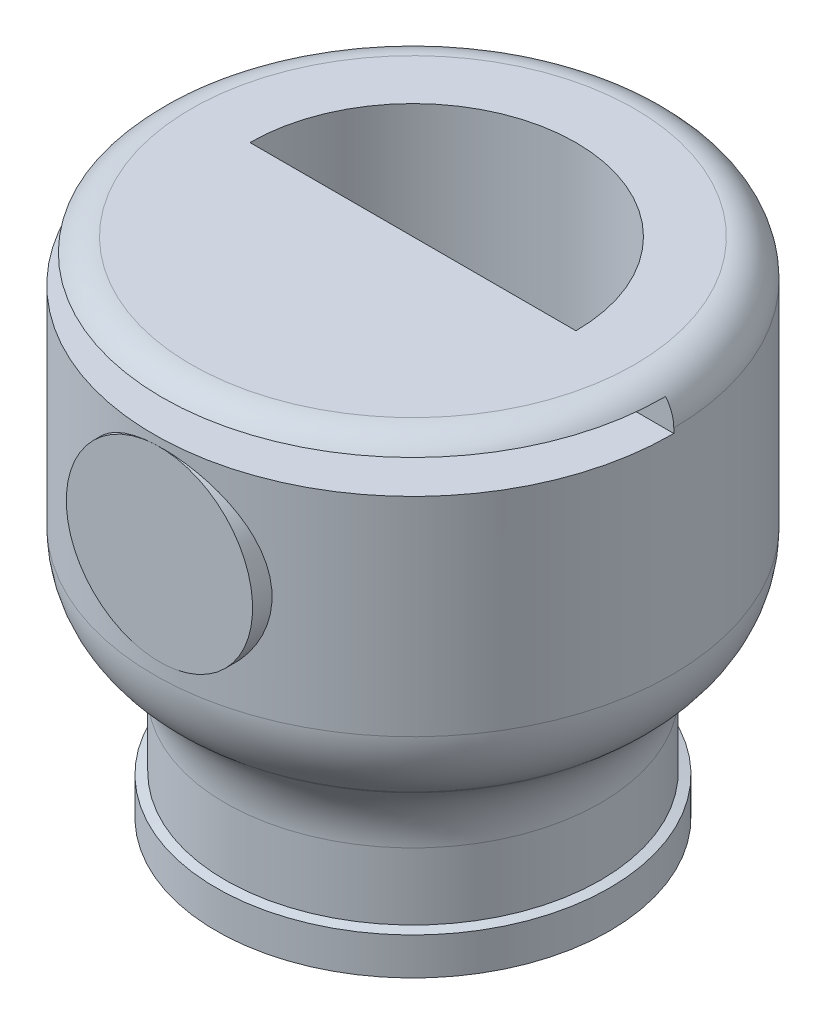
ISO-10303-21;
HEADER;
FILE_DESCRIPTION(('STEP AP214'),'2;1');
FILE_NAME('part.step','',(''),(''),'','','');
FILE_SCHEMA(('AUTOMOTIVE_DESIGN { 1 0 10303 214 1 1 1 1 }'));
ENDSEC;
DATA;
#1=APPLICATION_CONTEXT('core data for automotive mechanical design processes');
#2=APPLICATION_PROTOCOL_DEFINITION('international standard','automotive_design',2000,#1);
#3=PRODUCT_CONTEXT('',#1,'mechanical');
#4=PRODUCT('Part','Part','',(#3));
#5=PRODUCT_RELATED_PRODUCT_CATEGORY('part','',(#4));
#6=PRODUCT_DEFINITION_FORMATION('','',#4);
#7=PRODUCT_DEFINITION_CONTEXT('part definition',#1,'design');
#8=PRODUCT_DEFINITION('design','',#6,#7);
#9=PRODUCT_DEFINITION_SHAPE('','',#8);
#10=(LENGTH_UNIT() NAMED_UNIT(*) SI_UNIT(.MILLI.,.METRE.));
#11=(NAMED_UNIT(*) PLANE_ANGLE_UNIT() SI_UNIT($,.RADIAN.));
#12=(NAMED_UNIT(*) SI_UNIT($,.STERADIAN.) SOLID_ANGLE_UNIT());
#13=UNCERTAINTY_MEASURE_WITH_UNIT(LENGTH_MEASURE(1.E-05),#10,'distance_accuracy_value','');
#14=(GEOMETRIC_REPRESENTATION_CONTEXT(3) GLOBAL_UNCERTAINTY_ASSIGNED_CONTEXT((#13)) GLOBAL_UNIT_ASSIGNED_CONTEXT((#10,
#11,#12)) REPRESENTATION_CONTEXT('',''));
#15=CARTESIAN_POINT('',(0.,0.,0.));
#16=DIRECTION('',(0.,0.,1.));
#17=DIRECTION('',(1.,0.,0.));
#18=AXIS2_PLACEMENT_3D('',#15,#16,#17);
#19=CARTESIAN_POINT('',(2.76491495539483,7.82182165652493,0.));
#20=DIRECTION('',(0.,-1.,0.));
#21=DIRECTION('',(1.,0.,0.));
#22=AXIS2_PLACEMENT_3D('',#19,#20,#21);
#23=CYLINDRICAL_SURFACE('',#22,27.795529475795);
#24=CARTESIAN_POINT('',(2.76491495539483,49.5,0.));
#25=DIRECTION('',(0.,-1.,0.));
#26=DIRECTION('',(0.,0.,-1.));
#27=AXIS2_PLACEMENT_3D('',#24,#25,#26);
#28=CIRCLE('',#27,27.795529475795);
#29=CARTESIAN_POINT('',(-25.0298624433274,49.5,-0.204470524205008));
#30=VERTEX_POINT('',#29);
#31=CARTESIAN_POINT('',(30.559692354117,49.5,-0.204470524205008));
#32=VERTEX_POINT('',#31);
#33=EDGE_CURVE('E126',#30,#32,#28,.F.);
#34=ORIENTED_EDGE('',*,*,#33,.F.);
#35=DIRECTION('',(0.,-1.,0.));
#36=VECTOR('',#35,1.);
#37=CARTESIAN_POINT('',(-25.0298624433274,7.82182165652492,-0.204470524205008));
#38=LINE('',#37,#36);
#39=CARTESIAN_POINT('',(-25.0298624433274,50.,-0.204470524205008));
#40=VERTEX_POINT('',#39);
#41=EDGE_CURVE('E167',#30,#40,#38,.F.);
#42=ORIENTED_EDGE('',*,*,#41,.T.);
#43=CARTESIAN_POINT('',(2.76491495539482,50.,0.));
#44=DIRECTION('',(0.,-1.,0.));
#45=DIRECTION('',(1.,0.,0.));
#46=AXIS2_PLACEMENT_3D('',#43,#44,#45);
#47=CIRCLE('',#46,27.795529475795);
#48=CARTESIAN_POINT('',(30.5596923541171,50.,-0.204470524205008));
#49=VERTEX_POINT('',#48);
#50=EDGE_CURVE('E200',#40,#49,#47,.T.);
#51=ORIENTED_EDGE('',*,*,#50,.T.);
#52=DIRECTION('',(0.,-1.,0.));
#53=VECTOR('',#52,1.);
#54=CARTESIAN_POINT('',(30.5596923541171,7.82182165652493,-0.204470524205008));
#55=LINE('',#54,#53);
#56=EDGE_CURVE('E49',#49,#32,#55,.T.);
#57=ORIENTED_EDGE('',*,*,#56,.T.);
#58=EDGE_LOOP('',(#34,#42,#51,#57));
#59=FACE_BOUND('',#58,.T.);
#60=CARTESIAN_POINT('',(13.3463458867871,38.6583373621054,25.7026220118486));
#61=CARTESIAN_POINT('',(13.3463467506797,38.9277821022739,25.7026212426184));
#62=CARTESIAN_POINT('',(13.3354465811937,39.1972148635378,25.7071171137235));
#63=CARTESIAN_POINT('',(13.2919687629021,39.7340174371551,25.7249519118154));
#64=CARTESIAN_POINT('',(13.2593923457373,40.0013873658451,25.7382903363697));
#65=CARTESIAN_POINT('',(13.1729081194495,40.5320945802206,25.7733836810905));
#66=CARTESIAN_POINT('',(13.1189995294657,40.79543171792,25.7951389093522));
#67=CARTESIAN_POINT('',(12.9903943982892,41.3162067659098,25.8463887620421));
#68=CARTESIAN_POINT('',(12.9156973821031,41.5736445412607,25.8758835633105));
#69=CARTESIAN_POINT('',(12.7464464105734,42.0802133582729,25.9416402412638));
#70=CARTESIAN_POINT('',(12.651947157288,42.329365136829,25.9778834459237));
#71=CARTESIAN_POINT('',(12.44373220242,42.8186599126973,26.0561762717797));
#72=CARTESIAN_POINT('',(12.330009340582,43.0587995123479,26.0982280554375));
#73=CARTESIAN_POINT('',(12.0842401425005,43.528602925991,26.1869948362899));
#74=CARTESIAN_POINT('',(11.9521936997097,43.7582666790585,26.2337098605997));
#75=CARTESIAN_POINT('',(11.6706780123648,44.2058963523142,26.3306095370754));
#76=CARTESIAN_POINT('',(11.5212074978844,44.4238614181689,26.3807944420297));
#77=CARTESIAN_POINT('',(11.1985025620434,44.8567103541455,26.4857726252769));
#78=CARTESIAN_POINT('',(11.0244902858668,45.0709889713522,26.5406716961283));
#79=CARTESIAN_POINT('',(10.6595087786535,45.4842923905928,26.6515143306982));
#80=CARTESIAN_POINT('',(10.4685391398865,45.683316825634,26.7074579195059));
#81=CARTESIAN_POINT('',(10.0707167754452,46.0650127403382,26.8190118536809));
#82=CARTESIAN_POINT('',(9.86386023069171,46.2476802649348,26.8746221154337));
#83=CARTESIAN_POINT('',(9.43549130510837,46.5954921209992,26.9841386350754));
#84=CARTESIAN_POINT('',(9.21397928881647,46.7606368880596,27.038044935299));
#85=CARTESIAN_POINT('',(8.74863878036111,47.0784128766494,27.1449016086897));
#86=CARTESIAN_POINT('',(8.50427674096215,47.2303042566693,27.1977325815785));
#87=CARTESIAN_POINT('',(8.00273380579803,47.5127627227737,27.2987566692341));
#88=CARTESIAN_POINT('',(7.74555800532649,47.6433381980195,27.3469516054933));
#89=CARTESIAN_POINT('',(7.2200167476639,47.8821093354802,27.4374672990011));
#90=CARTESIAN_POINT('',(6.95165142646173,47.9903052695837,27.4797881276121));
#91=CARTESIAN_POINT('',(6.40564839316566,48.1832779921821,27.5574406379041));
#92=CARTESIAN_POINT('',(6.12801115886875,48.2680559853613,27.5927726790812));
#93=CARTESIAN_POINT('',(5.57638215157694,48.4105135832943,27.6543152072922));
#94=CARTESIAN_POINT('',(5.30266011964647,48.4691091447917,27.6808239838258));
#95=CARTESIAN_POINT('',(4.75062513289938,48.5632043331973,27.7258920994341));
#96=CARTESIAN_POINT('',(4.4723122799301,48.5987044717727,27.7444516146174));
#97=CARTESIAN_POINT('',(3.91333763495258,48.6461887564039,27.7732043831257));
#98=CARTESIAN_POINT('',(3.6326765478635,48.6581797221137,27.7834000621734));
#99=CARTESIAN_POINT('',(3.07116470286908,48.6584918943381,27.7952607055486));
#100=CARTESIAN_POINT('',(2.79031395171638,48.6468139032719,27.7969259590657));
#101=CARTESIAN_POINT('',(2.24491810603403,48.6010682628443,27.7919345123894));
#102=CARTESIAN_POINT('',(1.9802701976664,48.5681695673053,27.7856967619089));
#103=CARTESIAN_POINT('',(1.45472369944559,48.4814067313321,27.7658783501912));
#104=CARTESIAN_POINT('',(1.19382496243998,48.4275434160882,27.7522979779594));
#105=CARTESIAN_POINT('',(0.677577935562517,48.2993135221171,27.7182504886453));
#106=CARTESIAN_POINT('',(0.422229730170447,48.2249466315582,27.6977832668222));
#107=CARTESIAN_POINT('',(-0.0812182002820311,48.0563308589155,27.6505861686878));
#108=CARTESIAN_POINT('',(-0.329317769825685,47.9620815506179,27.6238561581216));
#109=CARTESIAN_POINT('',(-0.818471743992125,47.753692525213,27.5646864705793));
#110=CARTESIAN_POINT('',(-1.05946155178538,47.6394127245774,27.5322065644623));
#111=CARTESIAN_POINT('',(-1.53110602263131,47.3922583555493,27.4625657330638));
#112=CARTESIAN_POINT('',(-1.76175692596454,47.2593770940488,27.4254031233522));
#113=CARTESIAN_POINT('',(-2.21130548967729,46.9759762894753,27.3474083145757));
#114=CARTESIAN_POINT('',(-2.43020277787631,46.8254561883447,27.3065759994182));
#115=CARTESIAN_POINT('',(-2.85503064445834,46.5077508697439,27.2223176301386));
#116=CARTESIAN_POINT('',(-3.06096039890063,46.340564595066,27.1788914115441));
#117=CARTESIAN_POINT('',(-3.46888943397179,45.9815950003482,27.0883184701548));
#118=CARTESIAN_POINT('',(-3.670150520127,45.7889914436546,27.0410950137027));
#119=CARTESIAN_POINT('',(-4.05588736727981,45.3877061868811,26.9463832037301));
#120=CARTESIAN_POINT('',(-4.24036262263078,45.1790240028073,26.8988948422756));
#121=CARTESIAN_POINT('',(-4.5914220414673,44.7467994372934,26.8050143466062));
#122=CARTESIAN_POINT('',(-4.75800206361397,44.5232536353894,26.7586224680701));
#123=CARTESIAN_POINT('',(-5.07212087537345,44.0626976394474,26.6683153425431));
#124=CARTESIAN_POINT('',(-5.2196603768811,43.8256879492801,26.6244000029929));
#125=CARTESIAN_POINT('',(-5.49772859126478,43.3342142456592,26.5394385045658));
#126=CARTESIAN_POINT('',(-5.62780461077978,43.0794788683478,26.4984781635685));
#127=CARTESIAN_POINT('',(-5.86586399421236,42.559232637673,26.4218991371288));
#128=CARTESIAN_POINT('',(-5.97385638830328,42.2937262421033,26.3862782699295));
#129=CARTESIAN_POINT('',(-6.1668392723074,41.7537372736574,26.3215803603233));
#130=CARTESIAN_POINT('',(-6.2518328039325,41.4792558931539,26.2925024526638));
#131=CARTESIAN_POINT('',(-6.39800337069516,40.9233418126132,26.2419203231456));
#132=CARTESIAN_POINT('',(-6.45918167304372,40.6419094832844,26.2204156983175));
#133=CARTESIAN_POINT('',(-6.55494105559617,40.0867471613471,26.1865271745711));
#134=CARTESIAN_POINT('',(-6.59056927192223,39.8132193541774,26.1737851983376));
#135=CARTESIAN_POINT('',(-6.63910912568212,39.2639004168782,26.1563847172211));
#136=CARTESIAN_POINT('',(-6.6520214135389,38.9881093517795,26.1517259808916));
#137=CARTESIAN_POINT('',(-6.65499588625463,38.436440217703,26.1506546773984));
#138=CARTESIAN_POINT('',(-6.64506227006915,38.1605621740297,26.1542405949113));
#139=CARTESIAN_POINT('',(-6.60245672026117,37.6107987661365,26.1695303281976));
#140=CARTESIAN_POINT('',(-6.56978514634915,37.3369133704626,26.1812340155494));
#141=CARTESIAN_POINT('',(-6.48373595936502,36.8037277442479,26.2117512471871));
#142=CARTESIAN_POINT('',(-6.43120768216105,36.5442730018554,26.2302724288113));
#143=CARTESIAN_POINT('',(-6.30589572281171,36.0307712719075,26.2738700992557));
#144=CARTESIAN_POINT('',(-6.23310488253185,35.7767262296359,26.2989489044905));
#145=CARTESIAN_POINT('',(-6.06790705793705,35.2758269101046,26.3548915465073));
#146=CARTESIAN_POINT('',(-5.97550466195667,35.0289709662142,26.3857540299383));
#147=CARTESIAN_POINT('',(-5.77175338960273,34.5437867607262,26.4523767744537));
#148=CARTESIAN_POINT('',(-5.66039717760229,34.3054618442483,26.4881389307914));
#149=CARTESIAN_POINT('',(-5.41581964512394,33.831564001845,26.564712662015));
#150=CARTESIAN_POINT('',(-5.28202751992324,33.5963054174963,26.605646401383));
#151=CARTESIAN_POINT('',(-4.99603821175475,33.1376763735824,26.6904723195448));
#152=CARTESIAN_POINT('',(-4.84383279563464,32.9143112967348,26.734365817827));
#153=CARTESIAN_POINT('',(-4.52202772496277,32.4808325603602,26.8238664339569));
#154=CARTESIAN_POINT('',(-4.35242713478869,32.270719614599,26.8694736438951));
#155=CARTESIAN_POINT('',(-3.99685318796656,31.864943181332,26.9611508600873));
#156=CARTESIAN_POINT('',(-3.81087945517322,31.6692800259756,27.007220876952));
#157=CARTESIAN_POINT('',(-3.41386155361355,31.2840646941256,27.1008825380269));
#158=CARTESIAN_POINT('',(-3.20202640665692,31.0953168380638,27.1484339302512));
#159=CARTESIAN_POINT('',(-2.76286436248656,30.7363456425542,27.2412455306916));
#160=CARTESIAN_POINT('',(-2.53554312242131,30.5661155968439,27.2865065651682));
#161=CARTESIAN_POINT('',(-2.06667271203996,30.2452550666619,27.3734191976298));
#162=CARTESIAN_POINT('',(-1.82511812373015,30.0946321166597,27.4150694060318));
#163=CARTESIAN_POINT('',(-1.32953585786986,29.8142919890175,27.4934506514793));
#164=CARTESIAN_POINT('',(-1.07551358642064,29.6845658530069,27.5301837953007));
#165=CARTESIAN_POINT('',(-0.558963445896263,29.4480975901194,27.5972916324096));
#166=CARTESIAN_POINT('',(-0.296532196118554,29.3411599161002,27.6277203553277));
#167=CARTESIAN_POINT('',(0.237105421191776,29.1497639570286,27.681646347434));
#168=CARTESIAN_POINT('',(0.508311784862325,29.0653056620829,27.7051436196728));
#169=CARTESIAN_POINT('',(1.05736622775294,28.9196922101092,27.7443950186722));
#170=CARTESIAN_POINT('',(1.33521203382265,28.8585291955788,27.760151756837));
#171=CARTESIAN_POINT('',(1.89543988383297,28.7600674488549,27.7833412546476));
#172=CARTESIAN_POINT('',(2.17782171303057,28.7227675903324,27.7907744071749));
#173=CARTESIAN_POINT('',(2.73014021528458,28.6736923897316,27.7968081006747));
#174=CARTESIAN_POINT('',(2.99996433279007,28.6606955856305,27.7958459939314));
#175=CARTESIAN_POINT('',(3.53963003763627,28.6565651175248,27.7860414433971));
#176=CARTESIAN_POINT('',(3.8094716239489,28.6654306374236,27.7771992937672));
#177=CARTESIAN_POINT('',(4.34716757247668,28.7048945975942,27.7517634945061));
#178=CARTESIAN_POINT('',(4.61502208219522,28.7354914080766,27.7351704262052));
#179=CARTESIAN_POINT('',(5.14683840460148,28.8180812466258,27.6945666520365));
#180=CARTESIAN_POINT('',(5.41080019683061,28.870074387102,27.6705559071988));
#181=CARTESIAN_POINT('',(5.92904610024611,28.9939919992937,27.6160569422403));
#182=CARTESIAN_POINT('',(6.18341619783529,29.0656031552389,27.5856721734139));
#183=CARTESIAN_POINT('',(6.68506895537541,29.2284645935136,27.5188646144497));
#184=CARTESIAN_POINT('',(6.93234905101865,29.3197218823934,27.4824396712259));
#185=CARTESIAN_POINT('',(7.41818360014348,29.5210909377065,27.4043623721521));
#186=CARTESIAN_POINT('',(7.65673988387677,29.6311987214527,27.3627111209994));
#187=CARTESIAN_POINT('',(8.12391548923101,29.869502337868,27.2750634742108));
#188=CARTESIAN_POINT('',(8.35253092803971,29.9977051567529,27.2290654026116));
#189=CARTESIAN_POINT('',(8.80852283960875,30.2774457183902,27.1315873881407));
#190=CARTESIAN_POINT('',(9.03538233947552,30.4297729865935,27.079954013771));
#191=CARTESIAN_POINT('',(9.47561863541725,30.7522319968814,26.9742320700564));
#192=CARTESIAN_POINT('',(9.68898924827505,30.9223718105583,26.9201423940019));
#193=CARTESIAN_POINT('',(10.1009819192527,31.2793675026282,26.8108003364131));
#194=CARTESIAN_POINT('',(10.2996021560979,31.4662254390003,26.7555478123759));
#195=CARTESIAN_POINT('',(10.6809508336662,31.8555565786895,26.6452105314894));
#196=CARTESIAN_POINT('',(10.8636790200245,32.0580300318472,26.5901257773391));
#197=CARTESIAN_POINT('',(11.2206302863772,32.4876508411687,26.4788399761401));
#198=CARTESIAN_POINT('',(11.394011161067,32.7155185914245,26.4227143435104));
#199=CARTESIAN_POINT('',(11.7208572308537,33.1857229334844,26.3137271080731));
#200=CARTESIAN_POINT('',(11.8743299975217,33.4280539730205,26.2608642683739));
#201=CARTESIAN_POINT('',(12.1603208389707,33.9258673231902,26.1599086931028));
#202=CARTESIAN_POINT('',(12.2928309519575,34.1813545820673,26.1118177725189));
#203=CARTESIAN_POINT('',(12.5356343745004,34.7036110828207,26.0219381487292));
#204=CARTESIAN_POINT('',(12.6459377702971,34.9703751358822,25.9801465865465));
#205=CARTESIAN_POINT('',(12.8433877754872,35.5135432745424,25.9041898684053));
#206=CARTESIAN_POINT('',(12.9305241387967,35.789951564566,25.8700280879356));
#207=CARTESIAN_POINT('',(13.0806448742074,36.3501956411642,25.8105348341637));
#208=CARTESIAN_POINT('',(13.143629103182,36.6340314717442,25.7852034131907));
#209=CARTESIAN_POINT('',(13.2446847730938,37.2066584983713,25.7442976712579));
#210=CARTESIAN_POINT('',(13.2827686278462,37.4954471514337,25.7287184885891));
#211=CARTESIAN_POINT('',(13.3335977957686,38.0756077855596,25.7078814502822));
#212=CARTESIAN_POINT('',(13.346344952637,38.3669795771037,25.7026228436376));
#213=CARTESIAN_POINT('',(13.3463458867871,38.6583373621054,25.7026220118486));
#214=B_SPLINE_CURVE_WITH_KNOTS('',3,(#60,#61,#62,#63,#64,#65,#66,#67,#68,#69,#70,#71,#72,#73,
#74,#75,#76,#77,#78,#79,#80,#81,#82,#83,#84,#85,#86,#87,#88,#89,#90,#91,#92,#93,#94,#95,#96,#97,
#98,#99,#100,#101,#102,#103,#104,#105,#106,#107,#108,#109,#110,#111,#112,#113,#114,#115,#116,
#117,#118,#119,#120,#121,#122,#123,#124,#125,#126,#127,#128,#129,#130,#131,#132,#133,#134,#135,
#136,#137,#138,#139,#140,#141,#142,#143,#144,#145,#146,#147,#148,#149,#150,#151,#152,#153,#154,
#155,#156,#157,#158,#159,#160,#161,#162,#163,#164,#165,#166,#167,#168,#169,#170,#171,#172,#173,
#174,#175,#176,#177,#178,#179,#180,#181,#182,#183,#184,#185,#186,#187,#188,#189,#190,#191,#192,
#193,#194,#195,#196,#197,#198,#199,#200,#201,#202,#203,#204,#205,#206,#207,#208,#209,#210,#211,
#212,#213),.UNSPECIFIED.,.T.,.F.,(4,2,2,2,2,2,2,2,2,2,2,2,2,2,2,2,2,2,2,2,2,2,2,2,2,2,2,2,2,2,2,
2,2,2,2,2,2,2,2,2,2,2,2,2,2,2,2,2,2,2,2,2,2,2,2,2,2,2,2,2,2,2,2,2,2,2,2,2,2,2,2,2,2,2,2,2,4),
(0.,0.808057267816626,1.61606862586876,2.42410956378593,3.23216896609579,4.03802492206399,
4.84418170086265,5.65034316747197,6.45656342668973,7.29995003129204,8.14335692014369,
8.98696719539949,9.83055649470299,10.7070666362457,11.5832309794046,12.4593846774343,
13.3354932952741,14.1779427925391,15.0203736251361,15.8625600451619,16.7047179140628,
17.5040433523017,18.3033373313968,19.1026434673403,19.9019667395222,20.7071210172973,
21.5125657509117,22.318035974067,23.1235573242502,23.9702286044995,24.8169253809448,
25.6638176808941,26.5106783077056,27.3764233110585,28.2418135932405,29.1070893673299,
29.972319093704,30.7996703059205,31.6269978282852,32.4541733044068,33.2813356950554,
34.0765196457537,34.8719848675378,35.6672641864203,36.4628520021808,37.2831030231985,
38.1037221688819,38.9243854758148,39.7450676410223,40.6070903069241,41.4687997429028,
42.3308393387977,43.1925083929845,44.0464558479673,44.900402927119,45.7540617141408,
46.6076802059269,47.4171058287024,48.2265012369672,49.0358359491252,49.8451749133136,
50.6422741257852,51.4396580861568,52.236873784605,53.0343981220641,53.8677478695687,
54.7014768899097,55.5353086827934,56.3691538193559,57.2434367976375,58.117386282314,
58.9916669076093,59.8655495362763,60.7398180165261,61.6140916776499,62.4879291459793,
63.3617030246541),.UNSPECIFIED.);
#215=CARTESIAN_POINT('',(2.76491495539483,48.6414199557745,27.795529475795));
#216=VERTEX_POINT('',#215);
#217=CARTESIAN_POINT('',(2.76491495539483,28.6752547684362,27.795529475795));
#218=VERTEX_POINT('',#217);
#219=EDGE_CURVE('E233',#216,#218,#214,.T.);
#220=ORIENTED_EDGE('',*,*,#219,.F.);
#221=EDGE_CURVE('E226',#218,#216,#214,.T.);
#222=ORIENTED_EDGE('',*,*,#221,.F.);
#223=EDGE_LOOP('',(#220,#222));
#224=FACE_BOUND('',#223,.T.);
#225=CARTESIAN_POINT('',(2.76491495539483,27.1583373621054,0.));
#226=DIRECTION('',(0.,-1.,0.));
#227=DIRECTION('',(1.,0.,0.));
#228=AXIS2_PLACEMENT_3D('',#225,#226,#227);
#229=CIRCLE('',#228,27.795529475795);
#230=CARTESIAN_POINT('',(30.5604444311898,27.1583373621054,0.));
#231=VERTEX_POINT('',#230);
#232=EDGE_CURVE('E202',#231,#231,#229,.T.);
#233=ORIENTED_EDGE('',*,*,#232,.F.);
#234=EDGE_LOOP('',(#233));
#235=FACE_BOUND('',#234,.T.);
#236=ADVANCED_FACE('F34',(#59,#224,#235),#23,.T.);
#237=CARTESIAN_POINT('',(2.76491495539482,50.,0.));
#238=DIRECTION('',(0.,-1.,0.));
#239=DIRECTION('',(1.,0.,0.));
#240=AXIS2_PLACEMENT_3D('',#237,#238,#239);
#241=TOROIDAL_SURFACE('',#240,23.795529475795,4.);
#242=CARTESIAN_POINT('',(2.76491495539482,54.,0.));
#243=DIRECTION('',(0.,-1.,0.));
#244=DIRECTION('',(1.,0.,0.));
#245=AXIS2_PLACEMENT_3D('',#242,#243,#244);
#246=CIRCLE('',#245,23.795529475795);
#247=CARTESIAN_POINT('',(26.5604444311898,54.,0.));
#248=VERTEX_POINT('',#247);
#249=EDGE_CURVE('E197',#248,#248,#246,.T.);
#250=ORIENTED_EDGE('',*,*,#249,.T.);
#251=EDGE_LOOP('',(#250));
#252=FACE_BOUND('',#251,.T.);
#253=ORIENTED_EDGE('',*,*,#50,.F.);
#254=CARTESIAN_POINT('',(-24.5314051280273,51.9336759427929,-0.204470524205008));
#255=CARTESIAN_POINT('',(-24.4227775221481,52.1303558264312,-0.204470524205008));
#256=CARTESIAN_POINT('',(-24.2974608397906,52.3180053261456,-0.204470524205008));
#257=CARTESIAN_POINT('',(-24.0169936166561,52.6697545252074,-0.204470524205008));
#258=CARTESIAN_POINT('',(-23.8618073184071,52.8338255829973,-0.204470524205008));
#259=CARTESIAN_POINT('',(-23.5261474209365,53.1335153156774,-0.204470524205008));
#260=CARTESIAN_POINT('',(-23.3456859574281,53.2691475676978,-0.204470524205008));
#261=CARTESIAN_POINT('',(-22.9646026225883,53.5081515594489,-0.204470524205008));
#262=CARTESIAN_POINT('',(-22.7639857715993,53.6115313064872,-0.204470524205008));
#263=CARTESIAN_POINT('',(-22.3482182414279,53.7831609837609,-0.204470524205008));
#264=CARTESIAN_POINT('',(-22.133065731007,53.8514064783247,-0.204470524205008));
#265=CARTESIAN_POINT('',(-21.6943489108472,53.9508112477646,-0.204470524205008));
#266=CARTESIAN_POINT('',(-21.4707842697265,53.9819690600526,-0.204470524205008));
#267=CARTESIAN_POINT('',(-21.0215948407496,54.0063101772925,-0.204470524205008));
#268=CARTESIAN_POINT('',(-20.7959700319209,53.9994930952306,-0.204470524205008));
#269=CARTESIAN_POINT('',(-20.3490676435651,53.9480771472642,-0.204470524205008));
#270=CARTESIAN_POINT('',(-20.1277900558634,53.9034783524129,-0.204470524205008));
#271=CARTESIAN_POINT('',(-19.6958590097248,53.7777639273787,-0.204470524205008));
#272=CARTESIAN_POINT('',(-19.4852057391639,53.6966476516874,-0.204470524205008));
#273=CARTESIAN_POINT('',(-19.0805079003628,53.5002006151039,-0.204470524205008));
#274=CARTESIAN_POINT('',(-18.8864633022403,53.3848699157717,-0.204470524205008));
#275=CARTESIAN_POINT('',(-18.5204927542783,53.1232685682537,-0.204470524205008));
#276=CARTESIAN_POINT('',(-18.3485666173277,52.9769981818297,-0.204470524205008));
#277=CARTESIAN_POINT('',(-18.0317121789,52.6576684757407,-0.204470524205008));
#278=CARTESIAN_POINT('',(-17.8867839013364,52.4846091323476,-0.204470524205008));
#279=CARTESIAN_POINT('',(-17.6280453044935,52.1166208236156,-0.204470524205008));
#280=CARTESIAN_POINT('',(-17.5142338598575,51.9216926495345,-0.204470524205008));
#281=CARTESIAN_POINT('',(-17.3209538767335,51.5154950950823,-0.204470524205008));
#282=CARTESIAN_POINT('',(-17.2414853145748,51.3042257259744,-0.204470524205008));
#283=CARTESIAN_POINT('',(-17.119150809479,50.8713538935252,-0.204470524205008));
#284=CARTESIAN_POINT('',(-17.0762831113116,50.6497519262312,-0.204470524205008));
#285=CARTESIAN_POINT('',(-17.0283612795209,50.202496390005,-0.204470524205008));
#286=CARTESIAN_POINT('',(-17.0233071423582,49.976842821452,-0.204470524205008));
#287=CARTESIAN_POINT('',(-17.051155515113,49.5278974080903,-0.204470524205008));
#288=CARTESIAN_POINT('',(-17.084056810985,49.3046054879723,-0.204470524205008));
#289=CARTESIAN_POINT('',(-17.1868797282554,48.8667145764249,-0.204470524205008));
#290=CARTESIAN_POINT('',(-17.2568013476127,48.6521155845161,-0.204470524205008));
#291=CARTESIAN_POINT('',(-17.4316799658814,48.2377007160222,-0.204470524205008));
#292=CARTESIAN_POINT('',(-17.5366371775572,48.0378849292215,-0.204470524205008));
#293=CARTESIAN_POINT('',(-17.7786068257058,47.658709302277,-0.204470524205008));
#294=CARTESIAN_POINT('',(-17.9156192699505,47.4793494670928,-0.204470524205008));
#295=CARTESIAN_POINT('',(-18.217815691837,47.1461694961469,-0.204470524205008));
#296=CARTESIAN_POINT('',(-18.3830007904772,46.9923503771388,-0.204470524205008));
#297=CARTESIAN_POINT('',(-18.7368493806334,46.714626016031,-0.204470524205008));
#298=CARTESIAN_POINT('',(-18.9255128752464,46.5907207778771,-0.204470524205008));
#299=CARTESIAN_POINT('',(-19.3209722421414,46.3763354723866,-0.204470524205008));
#300=CARTESIAN_POINT('',(-19.5277689645231,46.2858569731591,-0.204470524205008));
#301=CARTESIAN_POINT('',(-19.9536170873084,46.1409012147814,-0.204470524205008));
#302=CARTESIAN_POINT('',(-20.1726684948993,46.0864239767461,-0.204470524205008));
#303=CARTESIAN_POINT('',(-20.6168144929739,46.0150160163402,-0.204470524205008));
#304=CARTESIAN_POINT('',(-20.8419092577687,45.9980863781508,-0.204470524205008));
#305=CARTESIAN_POINT('',(-21.2917459219618,46.0022575501037,-0.204470524205008));
#306=CARTESIAN_POINT('',(-21.5164878217192,46.0233583215111,-0.204470524205008));
#307=CARTESIAN_POINT('',(-21.9592392609592,46.1029916069076,-0.204470524205008));
#308=CARTESIAN_POINT('',(-22.1772487978452,46.161524135334,-0.204470524205008));
#309=CARTESIAN_POINT('',(-22.6003468366351,46.3143599614944,-0.204470524205008));
#310=CARTESIAN_POINT('',(-22.8054353163807,46.4086633205701,-0.204470524205008));
#311=CARTESIAN_POINT('',(-23.1968638933494,46.6303616129229,-0.204470524205008));
#312=CARTESIAN_POINT('',(-23.3832044187934,46.7577557901366,-0.204470524205008));
#313=CARTESIAN_POINT('',(-23.7318525093207,47.0420210432311,-0.204470524205008));
#314=CARTESIAN_POINT('',(-23.8941600297517,47.1988921738773,-0.204470524205008));
#315=CARTESIAN_POINT('',(-24.190131831661,47.5376560113988,-0.204470524205008));
#316=CARTESIAN_POINT('',(-24.3237964436981,47.7195484294713,-0.204470524205008));
#317=CARTESIAN_POINT('',(-24.5586848825309,48.1031856575392,-0.204470524205008));
#318=CARTESIAN_POINT('',(-24.6599099878553,48.3049296847191,-0.204470524205008));
#319=CARTESIAN_POINT('',(-24.8270424358491,48.7225194738146,-0.204470524205008));
#320=CARTESIAN_POINT('',(-24.8929544503442,48.9383633661154,-0.204470524205008));
#321=CARTESIAN_POINT('',(-24.9876190224243,49.3781131485816,-0.204470524205008));
#322=CARTESIAN_POINT('',(-25.0163623435814,49.6020210284465,-0.204470524205008));
#323=CARTESIAN_POINT('',(-25.0358587391659,50.0515668739339,-0.204470524205008));
#324=CARTESIAN_POINT('',(-25.0265943187674,50.2772055885473,-0.204470524205008));
#325=CARTESIAN_POINT('',(-24.9702900913168,50.7235300820394,-0.204470524205008));
#326=CARTESIAN_POINT('',(-24.9232957433234,50.9442214929706,-0.204470524205008));
#327=CARTESIAN_POINT('',(-24.8175066282487,51.2936255747833,-0.204470524205008));
#328=CARTESIAN_POINT('',(-24.7697521927196,51.4257852329525,-0.204470524205008));
#329=CARTESIAN_POINT('',(-24.6606388171705,51.6843637999811,-0.204470524205008));
#330=CARTESIAN_POINT('',(-24.5992798772472,51.8107827088813,-0.204470524205008));
#331=CARTESIAN_POINT('',(-24.5314051280273,51.9336759427929,-0.204470524205008));
#332=B_SPLINE_CURVE_WITH_KNOTS('',3,(#254,#255,#256,#257,#258,#259,#260,#261,#262,#263,#264,
#265,#266,#267,#268,#269,#270,#271,#272,#273,#274,#275,#276,#277,#278,#279,#280,#281,#282,#283,
#284,#285,#286,#287,#288,#289,#290,#291,#292,#293,#294,#295,#296,#297,#298,#299,#300,#301,#302,
#303,#304,#305,#306,#307,#308,#309,#310,#311,#312,#313,#314,#315,#316,#317,#318,#319,#320,#321,
#322,#323,#324,#325,#326,#327,#328,#329,#330,#331),.UNSPECIFIED.,.T.,.F.,(4,2,2,2,2,2,2,2,2,2,2,
2,2,2,2,2,2,2,2,2,2,2,2,2,2,2,2,2,2,2,2,2,2,2,2,2,2,2,4),(0.,0.673539777156794,1.34789093335966,
2.02191940702255,2.6957804066772,3.36972645990164,4.04369908995075,4.7176785886748,
5.39165681990224,6.06564696530402,6.73963589803943,7.4136191287901,8.08760295651857,
8.76156240603681,9.43552139103256,10.1094480538526,10.7833746535923,11.4572796976615,
12.1311847045777,12.8050938040641,13.4790030669428,14.1529391511336,14.8268753242194,
15.5008431088613,16.1748112887889,16.8487989291928,17.5227858831233,18.1967730970084,
18.8707614666897,19.5447344383525,20.2187086622102,20.8926751075221,21.566614986722,
22.2404656834808,22.914483800116,23.5888121996488,24.2623293489138,24.6831831771763,
25.1040370024462),.UNSPECIFIED.);
#333=CARTESIAN_POINT('',(-24.1523369248646,52.5,-0.204470524205008));
#334=VERTEX_POINT('',#333);
#335=EDGE_CURVE('E138',#40,#334,#332,.T.);
#336=ORIENTED_EDGE('',*,*,#335,.T.);
#337=CARTESIAN_POINT('',(2.76491495539482,52.5,0.));
#338=DIRECTION('',(0.,1.,0.));
#339=DIRECTION('',(0.,0.,1.));
#340=AXIS2_PLACEMENT_3D('',#337,#338,#339);
#341=CIRCLE('',#340,26.9180284749942);
#342=CARTESIAN_POINT('',(29.6821668356542,52.5,-0.204470524205008));
#343=VERTEX_POINT('',#342);
#344=EDGE_CURVE('E129',#343,#334,#341,.F.);
#345=ORIENTED_EDGE('',*,*,#344,.F.);
#346=CARTESIAN_POINT('',(22.6945862539554,51.0311396535216,-0.204470524205008));
#347=CARTESIAN_POINT('',(22.7525178398453,51.24822265137,-0.204470524205008));
#348=CARTESIAN_POINT('',(22.8288248584917,51.4605714320288,-0.204470524205008));
#349=CARTESIAN_POINT('',(23.0160751860105,51.8696183087938,-0.204470524205008));
#350=CARTESIAN_POINT('',(23.1270601127372,52.0662972412776,-0.204470524205008));
#351=CARTESIAN_POINT('',(23.3804373550399,52.4381493597383,-0.204470524205008));
#352=CARTESIAN_POINT('',(23.5228145922711,52.6133328077542,-0.204470524205008));
#353=CARTESIAN_POINT('',(23.8349204785242,52.9372613567799,-0.204470524205008));
#354=CARTESIAN_POINT('',(24.0046423243561,53.0860130145677,-0.204470524205008));
#355=CARTESIAN_POINT('',(24.3666724823721,53.3529373763533,-0.204470524205008));
#356=CARTESIAN_POINT('',(24.5589839410131,53.4711058131218,-0.204470524205008));
#357=CARTESIAN_POINT('',(24.9607229816289,53.6734848016306,-0.204470524205008));
#358=CARTESIAN_POINT('',(25.1701512390832,53.7576940124605,-0.204470524205008));
#359=CARTESIAN_POINT('',(25.6001767874546,53.8897597519121,-0.204470524205008));
#360=CARTESIAN_POINT('',(25.8207742986267,53.9376155633549,-0.204470524205008));
#361=CARTESIAN_POINT('',(26.2668721070778,53.9956131659459,-0.204470524205008));
#362=CARTESIAN_POINT('',(26.4923723949997,54.0057550290648,-0.204470524205008));
#363=CARTESIAN_POINT('',(26.9418782319933,53.9880367772086,-0.204470524205008));
#364=CARTESIAN_POINT('',(27.1658837600389,53.9601761287991,-0.204470524205008));
#365=CARTESIAN_POINT('',(27.6060374386033,53.8672424948304,-0.204470524205008));
#366=CARTESIAN_POINT('',(27.8221856036258,53.8021695779637,-0.204470524205008));
#367=CARTESIAN_POINT('',(28.2404860687916,53.6366593499829,-0.204470524205008));
#368=CARTESIAN_POINT('',(28.4426385509816,53.5362224989633,-0.204470524205008));
#369=CARTESIAN_POINT('',(28.8272119158373,53.3028348216239,-0.204470524205008));
#370=CARTESIAN_POINT('',(29.0096327803023,53.1698839653128,-0.204470524205008));
#371=CARTESIAN_POINT('',(29.3495587289811,52.8752463999728,-0.204470524205008));
#372=CARTESIAN_POINT('',(29.5070645174352,52.7135605034322,-0.204470524205008));
#373=CARTESIAN_POINT('',(29.7926947296352,52.3660400111857,-0.204470524205008));
#374=CARTESIAN_POINT('',(29.9208191699965,52.1802054291363,-0.204470524205008));
#375=CARTESIAN_POINT('',(30.1440457093324,51.78966877322,-0.204470524205008));
#376=CARTESIAN_POINT('',(30.2391487915639,51.584967261372,-0.204470524205008));
#377=CARTESIAN_POINT('',(30.3936377940108,51.1625029636989,-0.204470524205008));
#378=CARTESIAN_POINT('',(30.4530237143345,50.9447401779133,-0.204470524205008));
#379=CARTESIAN_POINT('',(30.5343913718809,50.5023402095155,-0.204470524205008));
#380=CARTESIAN_POINT('',(30.5563739415192,50.2777031800036,-0.204470524205008));
#381=CARTESIAN_POINT('',(30.5623133590283,49.8279269989692,-0.204470524205008));
#382=CARTESIAN_POINT('',(30.5462702113588,49.6027878475056,-0.204470524205008));
#383=CARTESIAN_POINT('',(30.476614001371,49.1584005293521,-0.204470524205008));
#384=CARTESIAN_POINT('',(30.4230012708432,48.9391523106549,-0.204470524205008));
#385=CARTESIAN_POINT('',(30.2797283551271,48.5127684944293,-0.204470524205008));
#386=CARTESIAN_POINT('',(30.1900681680942,48.3056328975207,-0.204470524205008));
#387=CARTESIAN_POINT('',(29.9772450896399,47.9093527412454,-0.204470524205008));
#388=CARTESIAN_POINT('',(29.8540819780459,47.7202083001229,-0.204470524205008));
#389=CARTESIAN_POINT('',(29.5777498514027,47.3652808566572,-0.204470524205008));
#390=CARTESIAN_POINT('',(29.4245808377159,47.1994978532533,-0.204470524205008));
#391=CARTESIAN_POINT('',(29.0925816888161,46.8959956321712,-0.204470524205008));
#392=CARTESIAN_POINT('',(28.9137510325369,46.7582769844843,-0.204470524205008));
#393=CARTESIAN_POINT('',(28.5355074564665,46.514816423761,-0.204470524205008));
#394=CARTESIAN_POINT('',(28.3360945252926,46.4090745284089,-0.204470524205008));
#395=CARTESIAN_POINT('',(27.922340910163,46.2325658946341,-0.204470524205008));
#396=CARTESIAN_POINT('',(27.7079997844228,46.1618001917981,-0.204470524205008));
#397=CARTESIAN_POINT('',(27.2704796493019,46.0572569192001,-0.204470524205008));
#398=CARTESIAN_POINT('',(27.0473006477287,46.0234793167632,-0.204470524205008));
#399=CARTESIAN_POINT('',(26.5984330934627,45.9938700768951,-0.204470524205008));
#400=CARTESIAN_POINT('',(26.3727444690238,45.9980395271098,-0.204470524205008));
#401=CARTESIAN_POINT('',(25.9252699777064,46.0442084748684,-0.204470524205008));
#402=CARTESIAN_POINT('',(25.7034841183785,46.0862080455928,-0.204470524205008));
#403=CARTESIAN_POINT('',(25.2701080605878,46.2068460322335,-0.204470524205008));
#404=CARTESIAN_POINT('',(25.0585180103886,46.2854849807689,-0.204470524205008));
#405=CARTESIAN_POINT('',(24.6515431723581,46.4771700997859,-0.204470524205008));
#406=CARTESIAN_POINT('',(24.4561584172331,46.5902163397077,-0.204470524205008));
#407=CARTESIAN_POINT('',(24.0871394804739,46.8475085920234,-0.204470524205008));
#408=CARTESIAN_POINT('',(23.9135055331229,46.9917549404355,-0.204470524205008));
#409=CARTESIAN_POINT('',(23.5929270109825,47.3073465796918,-0.204470524205008));
#410=CARTESIAN_POINT('',(23.4459813842224,47.4786908019237,-0.204470524205008));
#411=CARTESIAN_POINT('',(23.1829614845168,47.8435909264414,-0.204470524205008));
#412=CARTESIAN_POINT('',(23.0668829022709,48.0371437228158,-0.204470524205008));
#413=CARTESIAN_POINT('',(22.8688419618912,48.4410454667924,-0.204470524205008));
#414=CARTESIAN_POINT('',(22.7868880816371,48.6513985727821,-0.204470524205008));
#415=CARTESIAN_POINT('',(22.6594343213992,49.0829497413645,-0.204470524205008));
#416=CARTESIAN_POINT('',(22.6139501112068,49.304152422385,-0.204470524205008));
#417=CARTESIAN_POINT('',(22.5608369820579,49.7508712436395,-0.204470524205008));
#418=CARTESIAN_POINT('',(22.5531625774533,49.9763818731718,-0.204470524205008));
#419=CARTESIAN_POINT('',(22.5714714463387,50.3409851008364,-0.204470524205008));
#420=CARTESIAN_POINT('',(22.5859074176348,50.4807575361681,-0.204470524205008));
#421=CARTESIAN_POINT('',(22.6293664232865,50.7580159444028,-0.204470524205008));
#422=CARTESIAN_POINT('',(22.6583894571588,50.8955019173816,-0.204470524205008));
#423=CARTESIAN_POINT('',(22.6945862539554,51.0311396535216,-0.204470524205008));
#424=B_SPLINE_CURVE_WITH_KNOTS('',3,(#346,#347,#348,#349,#350,#351,#352,#353,#354,#355,#356,
#357,#358,#359,#360,#361,#362,#363,#364,#365,#366,#367,#368,#369,#370,#371,#372,#373,#374,#375,
#376,#377,#378,#379,#380,#381,#382,#383,#384,#385,#386,#387,#388,#389,#390,#391,#392,#393,#394,
#395,#396,#397,#398,#399,#400,#401,#402,#403,#404,#405,#406,#407,#408,#409,#410,#411,#412,#413,
#414,#415,#416,#417,#418,#419,#420,#421,#422,#423),.UNSPECIFIED.,.T.,.F.,(4,2,2,2,2,2,2,2,2,2,2,
2,2,2,2,2,2,2,2,2,2,2,2,2,2,2,2,2,2,2,2,2,2,2,2,2,2,2,4),(0.,0.673527528186261,1.34786649916976,
2.02188227474372,2.69573061707474,3.36967292978923,4.04364185111107,4.71762406812457,
5.3916049989527,6.06559539042625,6.73958453774112,7.41356491659627,8.08754591714023,
8.76150786378416,9.43546942929402,10.1094109249384,10.7833524185418,11.4572789133097,
12.1312053290393,12.805125793158,13.4790462917615,14.1529712193005,14.8268961162401,
15.5008346993316,16.1747736551323,16.8487325639448,17.5226908773886,18.1966685080188,
18.8706474424288,19.5446361746352,20.2186262670817,20.8926236186119,21.5665943974907,
22.2404710348935,22.9145149892557,23.5888484026873,24.2623703865384,24.6832036764967,
25.1040369525093),.UNSPECIFIED.);
#425=EDGE_CURVE('E117',#343,#49,#424,.T.);
#426=ORIENTED_EDGE('',*,*,#425,.T.);
#427=EDGE_LOOP('',(#253,#336,#345,#426));
#428=FACE_BOUND('',#427,.T.);
#429=ADVANCED_FACE('F137',(#252,#428),#241,.T.);
#430=CARTESIAN_POINT('',(-14.7350850446052,62.,0.));
#431=DIRECTION('',(0.,0.,-1.));
#432=DIRECTION('',(-1.,0.,0.));
#433=AXIS2_PLACEMENT_3D('',#430,#431,#432);
#434=PLANE('',#433);
#435=DIRECTION('',(-1.,0.,0.));
#436=VECTOR('',#435,1.);
#437=CARTESIAN_POINT('',(-14.7350850446052,49.5,0.));
#438=LINE('',#437,#436);
#439=CARTESIAN_POINT('',(20.2649149553948,49.5,0.));
#440=VERTEX_POINT('',#439);
#441=CARTESIAN_POINT('',(-14.7350850446052,49.5,0.));
#442=VERTEX_POINT('',#441);
#443=EDGE_CURVE('E336',#440,#442,#438,.T.);
#444=ORIENTED_EDGE('',*,*,#443,.F.);
#445=DIRECTION('',(0.,-1.,0.));
#446=VECTOR('',#445,1.);
#447=CARTESIAN_POINT('',(20.2649149553948,62.,0.));
#448=LINE('',#447,#446);
#449=CARTESIAN_POINT('',(20.2649149553948,14.9310408558861,0.));
#450=VERTEX_POINT('',#449);
#451=EDGE_CURVE('E170',#440,#450,#448,.T.);
#452=ORIENTED_EDGE('',*,*,#451,.T.);
#453=CARTESIAN_POINT('',(19.9,14.,0.));
#454=DIRECTION('',(0.,0.,-1.));
#455=DIRECTION('',(-1.,0.,0.));
#456=AXIS2_PLACEMENT_3D('',#453,#454,#455);
#457=CIRCLE('',#456,1.);
#458=CARTESIAN_POINT('',(19.9,15.,0.));
#459=VERTEX_POINT('',#458);
#460=EDGE_CURVE('E327',#459,#450,#457,.T.);
#461=ORIENTED_EDGE('',*,*,#460,.F.);
#462=DIRECTION('',(1.,0.,0.));
#463=VECTOR('',#462,1.);
#464=CARTESIAN_POINT('',(19.9,15.,0.));
#465=LINE('',#464,#463);
#466=CARTESIAN_POINT('',(-14.3701700892103,15.,0.));
#467=VERTEX_POINT('',#466);
#468=EDGE_CURVE('E178',#467,#459,#465,.T.);
#469=ORIENTED_EDGE('',*,*,#468,.F.);
#470=CARTESIAN_POINT('',(-14.3701700892103,14.,0.));
#471=DIRECTION('',(0.,0.,-1.));
#472=DIRECTION('',(-1.,0.,0.));
#473=AXIS2_PLACEMENT_3D('',#470,#471,#472);
#474=CIRCLE('',#473,1.);
#475=CARTESIAN_POINT('',(-14.7350850446052,14.9310408558861,0.));
#476=VERTEX_POINT('',#475);
#477=EDGE_CURVE('E234',#476,#467,#474,.T.);
#478=ORIENTED_EDGE('',*,*,#477,.F.);
#479=DIRECTION('',(0.,-1.,0.));
#480=VECTOR('',#479,1.);
#481=CARTESIAN_POINT('',(-14.7350850446052,62.,0.));
#482=LINE('',#481,#480);
#483=EDGE_CURVE('E174',#442,#476,#482,.T.);
#484=ORIENTED_EDGE('',*,*,#483,.F.);
#485=EDGE_LOOP('',(#444,#452,#461,#469,#478,#484));
#486=FACE_BOUND('',#485,.T.);
#487=ADVANCED_FACE('F257',(#486),#434,.T.);
#488=CARTESIAN_POINT('',(26.5604444311898,54.,0.));
#489=DIRECTION('',(0.,1.,0.));
#490=DIRECTION('',(-1.,0.,0.));
#491=AXIS2_PLACEMENT_3D('',#488,#489,#490);
#492=PLANE('',#491);
#493=ORIENTED_EDGE('',*,*,#249,.F.);
#494=EDGE_LOOP('',(#493));
#495=FACE_BOUND('',#494,.T.);
#496=DIRECTION('',(-1.,0.,0.));
#497=VECTOR('',#496,1.);
#498=CARTESIAN_POINT('',(26.5604444311898,54.,0.));
#499=LINE('',#498,#497);
#500=CARTESIAN_POINT('',(20.2649149553948,54.,0.));
#501=VERTEX_POINT('',#500);
#502=CARTESIAN_POINT('',(-14.7350850446052,54.,0.));
#503=VERTEX_POINT('',#502);
#504=EDGE_CURVE('E181',#501,#503,#499,.T.);
#505=ORIENTED_EDGE('',*,*,#504,.T.);
#506=CARTESIAN_POINT('',(2.76491495539482,54.,0.));
#507=DIRECTION('',(0.,1.,0.));
#508=DIRECTION('',(-1.,0.,0.));
#509=AXIS2_PLACEMENT_3D('',#506,#507,#508);
#510=CIRCLE('',#509,17.5);
#511=EDGE_CURVE('E184',#503,#501,#510,.F.);
#512=ORIENTED_EDGE('',*,*,#511,.T.);
#513=EDGE_LOOP('',(#505,#512));
#514=FACE_BOUND('',#513,.T.);
#515=ADVANCED_FACE('F254',(#495,#514),#492,.T.);
#516=CARTESIAN_POINT('',(19.9,15.,0.));
#517=DIRECTION('',(0.,-1.,0.));
#518=DIRECTION('',(1.,0.,0.));
#519=AXIS2_PLACEMENT_3D('',#516,#517,#518);
#520=PLANE('',#519);
#521=CARTESIAN_POINT('',(2.76491495539483,15.,0.));
#522=DIRECTION('',(0.,-1.,0.));
#523=DIRECTION('',(1.,0.,0.));
#524=AXIS2_PLACEMENT_3D('',#521,#522,#523);
#525=CIRCLE('',#524,17.1350850446052);
#526=EDGE_CURVE('E194',#459,#467,#525,.T.);
#527=ORIENTED_EDGE('',*,*,#526,.T.);
#528=ORIENTED_EDGE('',*,*,#468,.T.);
#529=EDGE_LOOP('',(#527,#528));
#530=FACE_BOUND('',#529,.T.);
#531=ADVANCED_FACE('F251',(#530),#520,.T.);
#532=CARTESIAN_POINT('',(2.76491495539483,14.,0.));
#533=DIRECTION('',(0.,-1.,0.));
#534=DIRECTION('',(1.,0.,0.));
#535=AXIS2_PLACEMENT_3D('',#532,#533,#534);
#536=TOROIDAL_SURFACE('',#535,17.1350850446052,1.);
#537=CARTESIAN_POINT('',(2.76491495539483,14.,0.));
#538=DIRECTION('',(0.,-1.,0.));
#539=DIRECTION('',(1.,0.,0.));
#540=AXIS2_PLACEMENT_3D('',#537,#538,#539);
#541=CIRCLE('',#540,18.1350850446052);
#542=CARTESIAN_POINT('',(20.9,14.,0.));
#543=VERTEX_POINT('',#542);
#544=EDGE_CURVE('E191',#543,#543,#541,.T.);
#545=ORIENTED_EDGE('',*,*,#544,.T.);
#546=EDGE_LOOP('',(#545));
#547=FACE_BOUND('',#546,.T.);
#548=ORIENTED_EDGE('',*,*,#526,.F.);
#549=ORIENTED_EDGE('',*,*,#460,.T.);
#550=CARTESIAN_POINT('',(2.76491495539483,14.9310408558861,0.));
#551=DIRECTION('',(0.,-1.,0.));
#552=DIRECTION('',(1.,0.,0.));
#553=AXIS2_PLACEMENT_3D('',#550,#551,#552);
#554=CIRCLE('',#553,17.5);
#555=EDGE_CURVE('E334',#450,#476,#554,.F.);
#556=ORIENTED_EDGE('',*,*,#555,.T.);
#557=ORIENTED_EDGE('',*,*,#477,.T.);
#558=EDGE_LOOP('',(#548,#549,#556,#557));
#559=FACE_BOUND('',#558,.T.);
#560=ADVANCED_FACE('F248',(#547,#559),#536,.F.);
#561=CARTESIAN_POINT('',(2.76491495539483,7.82182165652493,0.));
#562=DIRECTION('',(0.,-1.,0.));
#563=DIRECTION('',(1.,0.,0.));
#564=AXIS2_PLACEMENT_3D('',#561,#562,#563);
#565=CYLINDRICAL_SURFACE('',#564,18.1350850446052);
#566=CARTESIAN_POINT('',(2.76491495539483,0.,0.));
#567=DIRECTION('',(0.,-1.,0.));
#568=DIRECTION('',(1.,0.,0.));
#569=AXIS2_PLACEMENT_3D('',#566,#567,#568);
#570=CIRCLE('',#569,18.1350850446052);
#571=CARTESIAN_POINT('',(20.9,0.,0.));
#572=VERTEX_POINT('',#571);
#573=EDGE_CURVE('E223',#572,#572,#570,.T.);
#574=ORIENTED_EDGE('',*,*,#573,.T.);
#575=EDGE_LOOP('',(#574));
#576=FACE_BOUND('',#575,.T.);
#577=ORIENTED_EDGE('',*,*,#544,.F.);
#578=EDGE_LOOP('',(#577));
#579=FACE_BOUND('',#578,.T.);
#580=ADVANCED_FACE('F36',(#576,#579),#565,.F.);
#581=CARTESIAN_POINT('',(20.9,0.,0.));
#582=DIRECTION('',(0.,-1.,0.));
#583=DIRECTION('',(1.,0.,0.));
#584=AXIS2_PLACEMENT_3D('',#581,#582,#583);
#585=PLANE('',#584);
#586=CARTESIAN_POINT('',(2.76491495539483,0.,0.));
#587=DIRECTION('',(0.,-1.,0.));
#588=DIRECTION('',(1.,0.,0.));
#589=AXIS2_PLACEMENT_3D('',#586,#587,#588);
#590=CIRCLE('',#589,21.1066768821093);
#591=CARTESIAN_POINT('',(23.8715918375041,0.,0.));
#592=VERTEX_POINT('',#591);
#593=EDGE_CURVE('E220',#592,#592,#590,.T.);
#594=ORIENTED_EDGE('',*,*,#593,.T.);
#595=EDGE_LOOP('',(#594));
#596=FACE_BOUND('',#595,.T.);
#597=ORIENTED_EDGE('',*,*,#573,.F.);
#598=EDGE_LOOP('',(#597));
#599=FACE_BOUND('',#598,.T.);
#600=ADVANCED_FACE('F311',(#596,#599),#585,.T.);
#601=CARTESIAN_POINT('',(2.76491495539483,7.82182165652493,0.));
#602=DIRECTION('',(0.,-1.,0.));
#603=DIRECTION('',(1.,0.,0.));
#604=AXIS2_PLACEMENT_3D('',#601,#602,#603);
#605=CYLINDRICAL_SURFACE('',#604,21.1066768821093);
#606=CARTESIAN_POINT('',(2.76491495539483,4.,0.));
#607=DIRECTION('',(0.,-1.,0.));
#608=DIRECTION('',(1.,0.,0.));
#609=AXIS2_PLACEMENT_3D('',#606,#607,#608);
#610=CIRCLE('',#609,21.1066768821093);
#611=CARTESIAN_POINT('',(23.8715918375041,4.,0.));
#612=VERTEX_POINT('',#611);
#613=EDGE_CURVE('E217',#612,#612,#610,.T.);
#614=ORIENTED_EDGE('',*,*,#613,.T.);
#615=EDGE_LOOP('',(#614));
#616=FACE_BOUND('',#615,.T.);
#617=ORIENTED_EDGE('',*,*,#593,.F.);
#618=EDGE_LOOP('',(#617));
#619=FACE_BOUND('',#618,.T.);
#620=ADVANCED_FACE('F305',(#616,#619),#605,.T.);
#621=CARTESIAN_POINT('',(2.76491495539483,4.,0.));
#622=DIRECTION('',(0.,-1.,0.));
#623=DIRECTION('',(1.,0.,0.));
#624=AXIS2_PLACEMENT_3D('',#621,#622,#623);
#625=CONICAL_SURFACE('',#624,21.1066768821093,1.33186665186768);
#626=CARTESIAN_POINT('',(2.76491495539483,4.23666284308145,0.));
#627=DIRECTION('',(0.,-1.,0.));
#628=DIRECTION('',(1.,0.,0.));
#629=AXIS2_PLACEMENT_3D('',#626,#627,#628);
#630=CIRCLE('',#629,20.1350850446052);
#631=CARTESIAN_POINT('',(22.9,4.23666284308145,0.));
#632=VERTEX_POINT('',#631);
#633=EDGE_CURVE('E214',#632,#632,#630,.T.);
#634=ORIENTED_EDGE('',*,*,#633,.T.);
#635=EDGE_LOOP('',(#634));
#636=FACE_BOUND('',#635,.T.);
#637=ORIENTED_EDGE('',*,*,#613,.F.);
#638=EDGE_LOOP('',(#637));
#639=FACE_BOUND('',#638,.T.);
#640=ADVANCED_FACE('F299',(#636,#639),#625,.T.);
#641=CARTESIAN_POINT('',(2.76491495539483,7.82182165652493,0.));
#642=DIRECTION('',(0.,-1.,0.));
#643=DIRECTION('',(1.,0.,0.));
#644=AXIS2_PLACEMENT_3D('',#641,#642,#643);
#645=CYLINDRICAL_SURFACE('',#644,20.1350850446052);
#646=CARTESIAN_POINT('',(2.76491495539483,11.4043081021399,0.));
#647=DIRECTION('',(0.,-1.,0.));
#648=DIRECTION('',(1.,0.,0.));
#649=AXIS2_PLACEMENT_3D('',#646,#647,#648);
#650=CIRCLE('',#649,20.1350850446052);
#651=CARTESIAN_POINT('',(22.9,11.4043081021399,0.));
#652=VERTEX_POINT('',#651);
#653=EDGE_CURVE('E211',#652,#652,#650,.T.);
#654=ORIENTED_EDGE('',*,*,#653,.T.);
#655=EDGE_LOOP('',(#654));
#656=FACE_BOUND('',#655,.T.);
#657=ORIENTED_EDGE('',*,*,#633,.F.);
#658=EDGE_LOOP('',(#657));
#659=FACE_BOUND('',#658,.T.);
#660=ADVANCED_FACE('F293',(#656,#659),#645,.T.);
#661=CARTESIAN_POINT('',(2.76491495539483,11.40430810214,0.));
#662=DIRECTION('',(0.,-1.,0.));
#663=DIRECTION('',(1.,0.,0.));
#664=AXIS2_PLACEMENT_3D('',#661,#662,#663);
#665=TOROIDAL_SURFACE('',#664,30.1350850446052,10.);
#666=CARTESIAN_POINT('',(2.76491495539483,19.0647525333298,0.));
#667=DIRECTION('',(0.,-1.,0.));
#668=DIRECTION('',(1.,0.,0.));
#669=AXIS2_PLACEMENT_3D('',#666,#667,#668);
#670=CIRCLE('',#669,23.7072089477399);
#671=CARTESIAN_POINT('',(26.4721239031347,19.0647525333298,0.));
#672=VERTEX_POINT('',#671);
#673=EDGE_CURVE('E208',#672,#672,#670,.T.);
#674=ORIENTED_EDGE('',*,*,#673,.T.);
#675=EDGE_LOOP('',(#674));
#676=FACE_BOUND('',#675,.T.);
#677=ORIENTED_EDGE('',*,*,#653,.F.);
#678=EDGE_LOOP('',(#677));
#679=FACE_BOUND('',#678,.T.);
#680=ADVANCED_FACE('F287',(#676,#679),#665,.F.);
#681=CARTESIAN_POINT('',(2.76491495539483,19.0647525333298,0.));
#682=DIRECTION('',(0.,1.,0.));
#683=DIRECTION('',(-1.,0.,0.));
#684=AXIS2_PLACEMENT_3D('',#681,#682,#683);
#685=CONICAL_SURFACE('',#684,23.7072089477399,0.872664625997171);
#686=CARTESIAN_POINT('',(2.76491495539483,19.4978929309155,0.));
#687=DIRECTION('',(0.,-1.,0.));
#688=DIRECTION('',(1.,0.,0.));
#689=AXIS2_PLACEMENT_3D('',#686,#687,#688);
#690=CIRCLE('',#689,24.2234055726603);
#691=CARTESIAN_POINT('',(26.9883205280551,19.4978929309155,0.));
#692=VERTEX_POINT('',#691);
#693=EDGE_CURVE('E205',#692,#692,#690,.T.);
#694=ORIENTED_EDGE('',*,*,#693,.T.);
#695=EDGE_LOOP('',(#694));
#696=FACE_BOUND('',#695,.T.);
#697=ORIENTED_EDGE('',*,*,#673,.F.);
#698=EDGE_LOOP('',(#697));
#699=FACE_BOUND('',#698,.T.);
#700=ADVANCED_FACE('F282',(#696,#699),#685,.T.);
#701=CARTESIAN_POINT('',(2.76491495539483,27.1583373621054,0.));
#702=DIRECTION('',(0.,-1.,0.));
#703=DIRECTION('',(1.,0.,0.));
#704=AXIS2_PLACEMENT_3D('',#701,#702,#703);
#705=TOROIDAL_SURFACE('',#704,17.795529475795,10.);
#706=ORIENTED_EDGE('',*,*,#232,.T.);
#707=EDGE_LOOP('',(#706));
#708=FACE_BOUND('',#707,.T.);
#709=ORIENTED_EDGE('',*,*,#693,.F.);
#710=EDGE_LOOP('',(#709));
#711=FACE_BOUND('',#710,.T.);
#712=ADVANCED_FACE('F279',(#708,#711),#705,.T.);
#713=CARTESIAN_POINT('',(3.3463458867871,38.6583373621054,22.795529475795));
#714=DIRECTION('',(0.,0.,1.));
#715=DIRECTION('',(1.,0.,0.));
#716=AXIS2_PLACEMENT_3D('',#713,#714,#715);
#717=CYLINDRICAL_SURFACE('',#716,10.);
#718=CARTESIAN_POINT('',(3.3463458867871,38.6583373621054,27.795529475795));
#719=DIRECTION('',(0.,0.,1.));
#720=DIRECTION('',(1.,0.,0.));
#721=AXIS2_PLACEMENT_3D('',#718,#719,#720);
#722=CIRCLE('',#721,10.);
#723=EDGE_CURVE('E188',#216,#218,#722,.T.);
#724=ORIENTED_EDGE('',*,*,#723,.F.);
#725=ORIENTED_EDGE('',*,*,#219,.T.);
#726=EDGE_LOOP('',(#724,#725));
#727=FACE_BOUND('',#726,.T.);
#728=ADVANCED_FACE('F246',(#727),#717,.T.);
#729=CARTESIAN_POINT('',(3.3463458867871,38.6583373621054,27.795529475795));
#730=DIRECTION('',(0.,0.,1.));
#731=DIRECTION('',(1.,0.,0.));
#732=AXIS2_PLACEMENT_3D('',#729,#730,#731);
#733=PLANE('',#732);
#734=EDGE_CURVE('E187',#218,#216,#722,.T.);
#735=ORIENTED_EDGE('',*,*,#734,.T.);
#736=ORIENTED_EDGE('',*,*,#723,.T.);
#737=EDGE_LOOP('',(#735,#736));
#738=FACE_BOUND('',#737,.T.);
#739=ADVANCED_FACE('F244',(#738),#733,.T.);
#740=ORIENTED_EDGE('',*,*,#734,.F.);
#741=ORIENTED_EDGE('',*,*,#221,.T.);
#742=EDGE_LOOP('',(#740,#741));
#743=FACE_BOUND('',#742,.T.);
#744=ADVANCED_FACE('F238',(#743),#717,.T.);
#745=CARTESIAN_POINT('',(2.76491495539482,62.,0.));
#746=DIRECTION('',(0.,-1.,0.));
#747=DIRECTION('',(1.,0.,0.));
#748=AXIS2_PLACEMENT_3D('',#745,#746,#747);
#749=CYLINDRICAL_SURFACE('',#748,17.5);
#750=CARTESIAN_POINT('',(2.76491495539483,49.5,0.));
#751=DIRECTION('',(0.,-1.,0.));
#752=DIRECTION('',(0.,0.,-1.));
#753=AXIS2_PLACEMENT_3D('',#750,#751,#752);
#754=CIRCLE('',#753,17.5);
#755=CARTESIAN_POINT('',(-14.7338904839696,49.5,-0.204470524205008));
#756=VERTEX_POINT('',#755);
#757=EDGE_CURVE('E139',#442,#756,#754,.T.);
#758=ORIENTED_EDGE('',*,*,#757,.F.);
#759=ORIENTED_EDGE('',*,*,#483,.T.);
#760=ORIENTED_EDGE('',*,*,#555,.F.);
#761=ORIENTED_EDGE('',*,*,#451,.F.);
#762=CARTESIAN_POINT('',(20.2637203947593,49.5,-0.204470524205008));
#763=VERTEX_POINT('',#762);
#764=EDGE_CURVE('E141',#763,#440,#754,.T.);
#765=ORIENTED_EDGE('',*,*,#764,.F.);
#766=DIRECTION('',(0.,-1.,0.));
#767=VECTOR('',#766,1.);
#768=CARTESIAN_POINT('',(20.2637203947593,62.,-0.204470524205008));
#769=LINE('',#768,#767);
#770=CARTESIAN_POINT('',(20.2637203947593,52.5,-0.204470524205008));
#771=VERTEX_POINT('',#770);
#772=EDGE_CURVE('E42',#763,#771,#769,.F.);
#773=ORIENTED_EDGE('',*,*,#772,.T.);
#774=CARTESIAN_POINT('',(2.76491495539483,52.5,0.));
#775=DIRECTION('',(0.,1.,0.));
#776=DIRECTION('',(0.,0.,1.));
#777=AXIS2_PLACEMENT_3D('',#774,#775,#776);
#778=CIRCLE('',#777,17.5);
#779=CARTESIAN_POINT('',(20.2649149553948,52.5,0.));
#780=VERTEX_POINT('',#779);
#781=EDGE_CURVE('E132',#780,#771,#778,.T.);
#782=ORIENTED_EDGE('',*,*,#781,.F.);
#783=EDGE_CURVE('E171',#501,#780,#448,.T.);
#784=ORIENTED_EDGE('',*,*,#783,.F.);
#785=ORIENTED_EDGE('',*,*,#511,.F.);
#786=CARTESIAN_POINT('',(-14.7350850446052,52.5,0.));
#787=VERTEX_POINT('',#786);
#788=EDGE_CURVE('E175',#503,#787,#482,.T.);
#789=ORIENTED_EDGE('',*,*,#788,.T.);
#790=CARTESIAN_POINT('',(-14.7338904839696,52.5,-0.204470524205008));
#791=VERTEX_POINT('',#790);
#792=EDGE_CURVE('E57',#791,#787,#778,.T.);
#793=ORIENTED_EDGE('',*,*,#792,.F.);
#794=DIRECTION('',(0.,-1.,0.));
#795=VECTOR('',#794,1.);
#796=CARTESIAN_POINT('',(-14.7338904839696,62.,-0.204470524205008));
#797=LINE('',#796,#795);
#798=EDGE_CURVE('E11',#791,#756,#797,.T.);
#799=ORIENTED_EDGE('',*,*,#798,.T.);
#800=EDGE_LOOP('',(#758,#759,#760,#761,#765,#773,#782,#784,#785,#789,#793,#799));
#801=FACE_BOUND('',#800,.T.);
#802=ADVANCED_FACE('F243',(#801),#749,.F.);
#803=DIRECTION('',(1.,0.,0.));
#804=VECTOR('',#803,1.);
#805=CARTESIAN_POINT('',(-14.7350850446052,52.5,0.));
#806=LINE('',#805,#804);
#807=EDGE_CURVE('E333',#787,#780,#806,.T.);
#808=ORIENTED_EDGE('',*,*,#807,.F.);
#809=ORIENTED_EDGE('',*,*,#788,.F.);
#810=ORIENTED_EDGE('',*,*,#504,.F.);
#811=ORIENTED_EDGE('',*,*,#783,.T.);
#812=EDGE_LOOP('',(#808,#809,#810,#811));
#813=FACE_BOUND('',#812,.T.);
#814=ADVANCED_FACE('F264',(#813),#434,.T.);
#815=CARTESIAN_POINT('',(0.,0.,-0.204470524205008));
#816=DIRECTION('',(0.,0.,1.));
#817=DIRECTION('',(1.,0.,0.));
#818=AXIS2_PLACEMENT_3D('',#815,#816,#817);
#819=PLANE('',#818);
#820=DIRECTION('',(1.,0.,0.));
#821=VECTOR('',#820,1.);
#822=CARTESIAN_POINT('',(-26.9971430268331,49.5,-0.204470524205008));
#823=LINE('',#822,#821);
#824=EDGE_CURVE('E346',#30,#756,#823,.T.);
#825=ORIENTED_EDGE('',*,*,#824,.T.);
#826=ORIENTED_EDGE('',*,*,#798,.F.);
#827=DIRECTION('',(-1.,0.,0.));
#828=VECTOR('',#827,1.);
#829=CARTESIAN_POINT('',(-26.9971430268331,52.5,-0.204470524205008));
#830=LINE('',#829,#828);
#831=EDGE_CURVE('E134',#791,#334,#830,.T.);
#832=ORIENTED_EDGE('',*,*,#831,.T.);
#833=ORIENTED_EDGE('',*,*,#335,.F.);
#834=ORIENTED_EDGE('',*,*,#41,.F.);
#835=EDGE_LOOP('',(#825,#826,#832,#833,#834));
#836=FACE_BOUND('',#835,.T.);
#837=ADVANCED_FACE('F159',(#836),#819,.T.);
#838=CARTESIAN_POINT('',(-26.9971430268331,49.5,-0.204470524205008));
#839=DIRECTION('',(0.,-1.,0.));
#840=DIRECTION('',(0.,0.,-1.));
#841=AXIS2_PLACEMENT_3D('',#838,#839,#840);
#842=PLANE('',#841);
#843=ORIENTED_EDGE('',*,*,#33,.T.);
#844=EDGE_CURVE('E133',#763,#32,#823,.T.);
#845=ORIENTED_EDGE('',*,*,#844,.F.);
#846=ORIENTED_EDGE('',*,*,#764,.T.);
#847=ORIENTED_EDGE('',*,*,#443,.T.);
#848=ORIENTED_EDGE('',*,*,#757,.T.);
#849=ORIENTED_EDGE('',*,*,#824,.F.);
#850=EDGE_LOOP('',(#843,#845,#846,#847,#848,#849));
#851=FACE_BOUND('',#850,.T.);
#852=ADVANCED_FACE('F160',(#851),#842,.F.);
#853=CARTESIAN_POINT('',(-26.9971430268331,52.5,-0.204470524205008));
#854=DIRECTION('',(0.,1.,0.));
#855=DIRECTION('',(0.,0.,1.));
#856=AXIS2_PLACEMENT_3D('',#853,#854,#855);
#857=PLANE('',#856);
#858=ORIENTED_EDGE('',*,*,#344,.T.);
#859=ORIENTED_EDGE('',*,*,#831,.F.);
#860=ORIENTED_EDGE('',*,*,#792,.T.);
#861=ORIENTED_EDGE('',*,*,#807,.T.);
#862=ORIENTED_EDGE('',*,*,#781,.T.);
#863=EDGE_CURVE('E120',#343,#771,#830,.T.);
#864=ORIENTED_EDGE('',*,*,#863,.F.);
#865=EDGE_LOOP('',(#858,#859,#860,#861,#862,#864));
#866=FACE_BOUND('',#865,.T.);
#867=ADVANCED_FACE('F128',(#866),#857,.F.);
#868=ORIENTED_EDGE('',*,*,#425,.F.);
#869=ORIENTED_EDGE('',*,*,#863,.T.);
#870=ORIENTED_EDGE('',*,*,#772,.F.);
#871=ORIENTED_EDGE('',*,*,#844,.T.);
#872=ORIENTED_EDGE('',*,*,#56,.F.);
#873=EDGE_LOOP('',(#868,#869,#870,#871,#872));
#874=FACE_BOUND('',#873,.T.);
#875=ADVANCED_FACE('F119',(#874),#819,.T.);
#876=CLOSED_SHELL('',(#236,#429,#487,#515,#531,#560,#580,#600,#620,#640,#660,#680,#700,#712,
#728,#739,#744,#802,#814,#837,#852,#867,#875));
#877=MANIFOLD_SOLID_BREP('B2',#876);
#878=ADVANCED_BREP_SHAPE_REPRESENTATION('',(#18,#877),#14);
#879=SHAPE_DEFINITION_REPRESENTATION(#9,#878);
ENDSEC;
END-ISO-10303-21;
